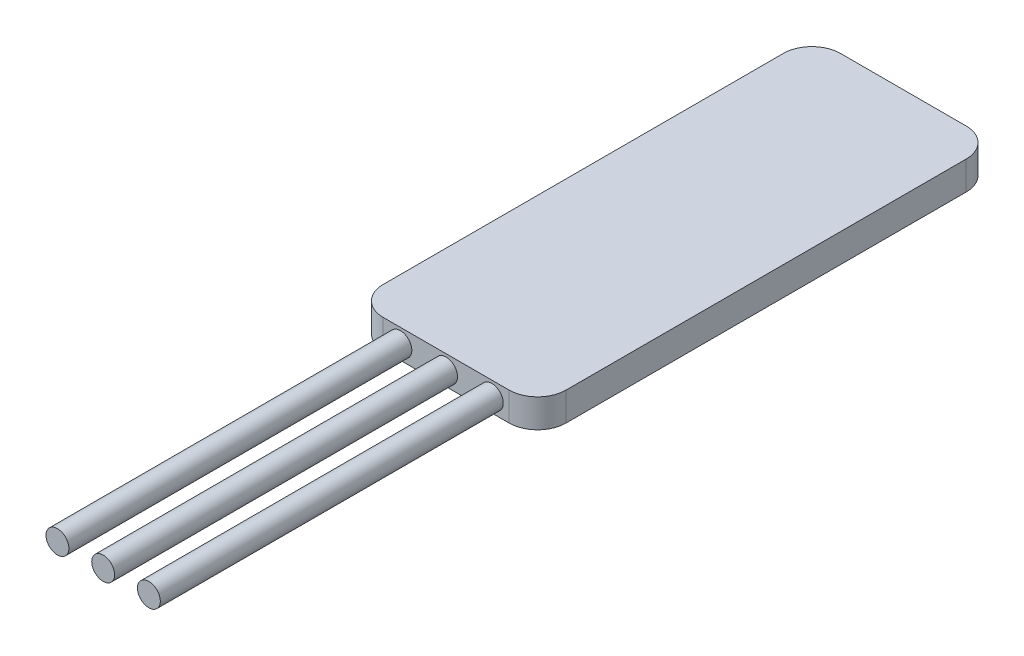
ISO-10303-21;
HEADER;
FILE_DESCRIPTION(('STEP AP214'),'2;1');
FILE_NAME('part.step','',(''),(''),'','','');
FILE_SCHEMA(('AUTOMOTIVE_DESIGN { 1 0 10303 214 1 1 1 1 }'));
ENDSEC;
DATA;
#1=APPLICATION_CONTEXT('core data for automotive mechanical design processes');
#2=APPLICATION_PROTOCOL_DEFINITION('international standard','automotive_design',2000,#1);
#3=PRODUCT_CONTEXT('',#1,'mechanical');
#4=PRODUCT('Part','Part','',(#3));
#5=PRODUCT_RELATED_PRODUCT_CATEGORY('part','',(#4));
#6=PRODUCT_DEFINITION_FORMATION('','',#4);
#7=PRODUCT_DEFINITION_CONTEXT('part definition',#1,'design');
#8=PRODUCT_DEFINITION('design','',#6,#7);
#9=PRODUCT_DEFINITION_SHAPE('','',#8);
#10=(LENGTH_UNIT() NAMED_UNIT(*) SI_UNIT(.MILLI.,.METRE.));
#11=(NAMED_UNIT(*) PLANE_ANGLE_UNIT() SI_UNIT($,.RADIAN.));
#12=(NAMED_UNIT(*) SI_UNIT($,.STERADIAN.) SOLID_ANGLE_UNIT());
#13=UNCERTAINTY_MEASURE_WITH_UNIT(LENGTH_MEASURE(1.E-05),#10,'distance_accuracy_value','');
#14=(GEOMETRIC_REPRESENTATION_CONTEXT(3) GLOBAL_UNCERTAINTY_ASSIGNED_CONTEXT((#13)) GLOBAL_UNIT_ASSIGNED_CONTEXT((#10,
#11,#12)) REPRESENTATION_CONTEXT('',''));
#15=CARTESIAN_POINT('',(0.,0.,0.));
#16=DIRECTION('',(0.,0.,1.));
#17=DIRECTION('',(1.,0.,0.));
#18=AXIS2_PLACEMENT_3D('',#15,#16,#17);
#19=CARTESIAN_POINT('',(3.2,0.5,-8.));
#20=DIRECTION('',(-1.,0.,0.));
#21=DIRECTION('',(0.,0.,1.));
#22=AXIS2_PLACEMENT_3D('',#19,#20,#21);
#23=PLANE('',#22);
#24=DIRECTION('',(0.,0.,-1.));
#25=VECTOR('',#24,1.);
#26=CARTESIAN_POINT('',(3.2,-0.5,-8.));
#27=LINE('',#26,#25);
#28=CARTESIAN_POINT('',(3.2,-0.5,7.));
#29=VERTEX_POINT('',#28);
#30=CARTESIAN_POINT('',(3.2,-0.5,-7.));
#31=VERTEX_POINT('',#30);
#32=EDGE_CURVE('E132',#29,#31,#27,.T.);
#33=ORIENTED_EDGE('',*,*,#32,.T.);
#34=DIRECTION('',(0.,-1.,0.));
#35=VECTOR('',#34,1.);
#36=CARTESIAN_POINT('',(3.2,0.5,-7.));
#37=LINE('',#36,#35);
#38=CARTESIAN_POINT('',(3.2,0.5,-7.));
#39=VERTEX_POINT('',#38);
#40=EDGE_CURVE('E154',#31,#39,#37,.F.);
#41=ORIENTED_EDGE('',*,*,#40,.T.);
#42=DIRECTION('',(0.,0.,-1.));
#43=VECTOR('',#42,1.);
#44=CARTESIAN_POINT('',(3.2,0.5,-8.));
#45=LINE('',#44,#43);
#46=CARTESIAN_POINT('',(3.2,0.5,7.));
#47=VERTEX_POINT('',#46);
#48=EDGE_CURVE('E130',#47,#39,#45,.T.);
#49=ORIENTED_EDGE('',*,*,#48,.F.);
#50=DIRECTION('',(0.,-1.,0.));
#51=VECTOR('',#50,1.);
#52=CARTESIAN_POINT('',(3.2,0.5,7.));
#53=LINE('',#52,#51);
#54=EDGE_CURVE('E151',#47,#29,#53,.T.);
#55=ORIENTED_EDGE('',*,*,#54,.T.);
#56=EDGE_LOOP('',(#33,#41,#49,#55));
#57=FACE_BOUND('',#56,.T.);
#58=ADVANCED_FACE('F34',(#57),#23,.F.);
#59=CARTESIAN_POINT('',(-3.2,0.5,-8.));
#60=DIRECTION('',(0.,0.,1.));
#61=DIRECTION('',(1.,0.,0.));
#62=AXIS2_PLACEMENT_3D('',#59,#60,#61);
#63=PLANE('',#62);
#64=DIRECTION('',(-1.,0.,0.));
#65=VECTOR('',#64,1.);
#66=CARTESIAN_POINT('',(-3.2,-0.5,-8.));
#67=LINE('',#66,#65);
#68=CARTESIAN_POINT('',(2.2,-0.5,-8.));
#69=VERTEX_POINT('',#68);
#70=CARTESIAN_POINT('',(-2.2,-0.5,-8.));
#71=VERTEX_POINT('',#70);
#72=EDGE_CURVE('E128',#69,#71,#67,.T.);
#73=ORIENTED_EDGE('',*,*,#72,.T.);
#74=DIRECTION('',(0.,-1.,0.));
#75=VECTOR('',#74,1.);
#76=CARTESIAN_POINT('',(-2.2,0.5,-8.));
#77=LINE('',#76,#75);
#78=CARTESIAN_POINT('',(-2.2,0.5,-8.));
#79=VERTEX_POINT('',#78);
#80=EDGE_CURVE('E106',#71,#79,#77,.F.);
#81=ORIENTED_EDGE('',*,*,#80,.T.);
#82=DIRECTION('',(-1.,0.,0.));
#83=VECTOR('',#82,1.);
#84=CARTESIAN_POINT('',(-3.2,0.5,-8.));
#85=LINE('',#84,#83);
#86=CARTESIAN_POINT('',(2.2,0.5,-8.));
#87=VERTEX_POINT('',#86);
#88=EDGE_CURVE('E180',#87,#79,#85,.T.);
#89=ORIENTED_EDGE('',*,*,#88,.F.);
#90=DIRECTION('',(0.,-1.,0.));
#91=VECTOR('',#90,1.);
#92=CARTESIAN_POINT('',(2.2,0.5,-8.));
#93=LINE('',#92,#91);
#94=EDGE_CURVE('E111',#87,#69,#93,.T.);
#95=ORIENTED_EDGE('',*,*,#94,.T.);
#96=EDGE_LOOP('',(#73,#81,#89,#95));
#97=FACE_BOUND('',#96,.T.);
#98=ADVANCED_FACE('F207',(#97),#63,.F.);
#99=CARTESIAN_POINT('',(-3.2,0.5,-8.));
#100=DIRECTION('',(1.,0.,0.));
#101=DIRECTION('',(0.,0.,-1.));
#102=AXIS2_PLACEMENT_3D('',#99,#100,#101);
#103=PLANE('',#102);
#104=DIRECTION('',(0.,0.,1.));
#105=VECTOR('',#104,1.);
#106=CARTESIAN_POINT('',(-3.2,0.5,-8.));
#107=LINE('',#106,#105);
#108=CARTESIAN_POINT('',(-3.2,0.5,-7.));
#109=VERTEX_POINT('',#108);
#110=CARTESIAN_POINT('',(-3.2,0.5,7.));
#111=VERTEX_POINT('',#110);
#112=EDGE_CURVE('E120',#109,#111,#107,.T.);
#113=ORIENTED_EDGE('',*,*,#112,.F.);
#114=DIRECTION('',(0.,-1.,0.));
#115=VECTOR('',#114,1.);
#116=CARTESIAN_POINT('',(-3.2,0.5,-7.));
#117=LINE('',#116,#115);
#118=CARTESIAN_POINT('',(-3.2,-0.5,-7.));
#119=VERTEX_POINT('',#118);
#120=EDGE_CURVE('E105',#109,#119,#117,.T.);
#121=ORIENTED_EDGE('',*,*,#120,.T.);
#122=DIRECTION('',(0.,0.,1.));
#123=VECTOR('',#122,1.);
#124=CARTESIAN_POINT('',(-3.2,-0.5,-8.));
#125=LINE('',#124,#123);
#126=CARTESIAN_POINT('',(-3.2,-0.5,7.));
#127=VERTEX_POINT('',#126);
#128=EDGE_CURVE('E118',#119,#127,#125,.T.);
#129=ORIENTED_EDGE('',*,*,#128,.T.);
#130=DIRECTION('',(0.,-1.,0.));
#131=VECTOR('',#130,1.);
#132=CARTESIAN_POINT('',(-3.2,0.5,7.));
#133=LINE('',#132,#131);
#134=EDGE_CURVE('E122',#127,#111,#133,.F.);
#135=ORIENTED_EDGE('',*,*,#134,.T.);
#136=EDGE_LOOP('',(#113,#121,#129,#135));
#137=FACE_BOUND('',#136,.T.);
#138=ADVANCED_FACE('F117',(#137),#103,.F.);
#139=CARTESIAN_POINT('',(-3.2,0.5,8.));
#140=DIRECTION('',(0.,0.,-1.));
#141=DIRECTION('',(-1.,0.,0.));
#142=AXIS2_PLACEMENT_3D('',#139,#140,#141);
#143=PLANE('',#142);
#144=CARTESIAN_POINT('',(1.6,0.,8.));
#145=DIRECTION('',(0.,0.,-1.));
#146=DIRECTION('',(-1.,0.,0.));
#147=AXIS2_PLACEMENT_3D('',#144,#145,#146);
#148=CIRCLE('',#147,0.4);
#149=CARTESIAN_POINT('',(1.2,0.,8.));
#150=VERTEX_POINT('',#149);
#151=EDGE_CURVE('E11',#150,#150,#148,.F.);
#152=ORIENTED_EDGE('',*,*,#151,.F.);
#153=EDGE_LOOP('',(#152));
#154=FACE_BOUND('',#153,.T.);
#155=CARTESIAN_POINT('',(-1.6,0.,8.));
#156=DIRECTION('',(0.,0.,-1.));
#157=DIRECTION('',(-1.,0.,0.));
#158=AXIS2_PLACEMENT_3D('',#155,#156,#157);
#159=CIRCLE('',#158,0.4);
#160=CARTESIAN_POINT('',(-2.,0.,8.));
#161=VERTEX_POINT('',#160);
#162=EDGE_CURVE('E42',#161,#161,#159,.F.);
#163=ORIENTED_EDGE('',*,*,#162,.F.);
#164=EDGE_LOOP('',(#163));
#165=FACE_BOUND('',#164,.T.);
#166=CARTESIAN_POINT('',(0.,0.,8.));
#167=DIRECTION('',(0.,0.,-1.));
#168=DIRECTION('',(-1.,0.,0.));
#169=AXIS2_PLACEMENT_3D('',#166,#167,#168);
#170=CIRCLE('',#169,0.4);
#171=CARTESIAN_POINT('',(-0.4,0.,8.));
#172=VERTEX_POINT('',#171);
#173=EDGE_CURVE('E160',#172,#172,#170,.F.);
#174=ORIENTED_EDGE('',*,*,#173,.F.);
#175=EDGE_LOOP('',(#174));
#176=FACE_BOUND('',#175,.T.);
#177=DIRECTION('',(1.,0.,0.));
#178=VECTOR('',#177,1.);
#179=CARTESIAN_POINT('',(-3.2,0.5,8.));
#180=LINE('',#179,#178);
#181=CARTESIAN_POINT('',(-2.2,0.5,8.));
#182=VERTEX_POINT('',#181);
#183=CARTESIAN_POINT('',(2.2,0.5,8.));
#184=VERTEX_POINT('',#183);
#185=EDGE_CURVE('E136',#182,#184,#180,.T.);
#186=ORIENTED_EDGE('',*,*,#185,.F.);
#187=DIRECTION('',(0.,-1.,0.));
#188=VECTOR('',#187,1.);
#189=CARTESIAN_POINT('',(-2.2,0.5,8.));
#190=LINE('',#189,#188);
#191=CARTESIAN_POINT('',(-2.2,-0.5,8.));
#192=VERTEX_POINT('',#191);
#193=EDGE_CURVE('E157',#182,#192,#190,.T.);
#194=ORIENTED_EDGE('',*,*,#193,.T.);
#195=DIRECTION('',(1.,0.,0.));
#196=VECTOR('',#195,1.);
#197=CARTESIAN_POINT('',(-3.2,-0.5,8.));
#198=LINE('',#197,#196);
#199=CARTESIAN_POINT('',(2.2,-0.5,8.));
#200=VERTEX_POINT('',#199);
#201=EDGE_CURVE('E127',#192,#200,#198,.T.);
#202=ORIENTED_EDGE('',*,*,#201,.T.);
#203=DIRECTION('',(0.,-1.,0.));
#204=VECTOR('',#203,1.);
#205=CARTESIAN_POINT('',(2.2,0.5,8.));
#206=LINE('',#205,#204);
#207=EDGE_CURVE('E49',#200,#184,#206,.F.);
#208=ORIENTED_EDGE('',*,*,#207,.T.);
#209=EDGE_LOOP('',(#186,#194,#202,#208));
#210=FACE_BOUND('',#209,.T.);
#211=ADVANCED_FACE('F167',(#154,#165,#176,#210),#143,.F.);
#212=CARTESIAN_POINT('',(0.,0.5,0.));
#213=DIRECTION('',(0.,1.,0.));
#214=DIRECTION('',(0.,0.,1.));
#215=AXIS2_PLACEMENT_3D('',#212,#213,#214);
#216=PLANE('',#215);
#217=ORIENTED_EDGE('',*,*,#88,.T.);
#218=CARTESIAN_POINT('',(-2.2,0.5,-7.));
#219=DIRECTION('',(0.,1.,0.));
#220=DIRECTION('',(0.,0.,1.));
#221=AXIS2_PLACEMENT_3D('',#218,#219,#220);
#222=CIRCLE('',#221,1.);
#223=EDGE_CURVE('E149',#79,#109,#222,.T.);
#224=ORIENTED_EDGE('',*,*,#223,.T.);
#225=ORIENTED_EDGE('',*,*,#112,.T.);
#226=CARTESIAN_POINT('',(-2.2,0.5,7.));
#227=DIRECTION('',(0.,1.,0.));
#228=DIRECTION('',(0.,0.,1.));
#229=AXIS2_PLACEMENT_3D('',#226,#227,#228);
#230=CIRCLE('',#229,1.);
#231=EDGE_CURVE('E56',#111,#182,#230,.T.);
#232=ORIENTED_EDGE('',*,*,#231,.T.);
#233=ORIENTED_EDGE('',*,*,#185,.T.);
#234=CARTESIAN_POINT('',(2.2,0.5,7.));
#235=DIRECTION('',(0.,1.,0.));
#236=DIRECTION('',(0.,0.,1.));
#237=AXIS2_PLACEMENT_3D('',#234,#235,#236);
#238=CIRCLE('',#237,1.);
#239=EDGE_CURVE('E144',#184,#47,#238,.T.);
#240=ORIENTED_EDGE('',*,*,#239,.T.);
#241=ORIENTED_EDGE('',*,*,#48,.T.);
#242=CARTESIAN_POINT('',(2.2,0.5,-7.));
#243=DIRECTION('',(0.,1.,0.));
#244=DIRECTION('',(0.,0.,1.));
#245=AXIS2_PLACEMENT_3D('',#242,#243,#244);
#246=CIRCLE('',#245,1.);
#247=EDGE_CURVE('E147',#39,#87,#246,.T.);
#248=ORIENTED_EDGE('',*,*,#247,.T.);
#249=EDGE_LOOP('',(#217,#224,#225,#232,#233,#240,#241,#248));
#250=FACE_BOUND('',#249,.T.);
#251=ADVANCED_FACE('F170',(#250),#216,.T.);
#252=CARTESIAN_POINT('',(0.,-0.5,0.));
#253=DIRECTION('',(0.,1.,0.));
#254=DIRECTION('',(0.,0.,1.));
#255=AXIS2_PLACEMENT_3D('',#252,#253,#254);
#256=PLANE('',#255);
#257=ORIENTED_EDGE('',*,*,#128,.F.);
#258=CARTESIAN_POINT('',(-2.2,-0.5,-7.));
#259=DIRECTION('',(0.,1.,0.));
#260=DIRECTION('',(0.,0.,1.));
#261=AXIS2_PLACEMENT_3D('',#258,#259,#260);
#262=CIRCLE('',#261,1.);
#263=EDGE_CURVE('E101',#119,#71,#262,.F.);
#264=ORIENTED_EDGE('',*,*,#263,.T.);
#265=ORIENTED_EDGE('',*,*,#72,.F.);
#266=CARTESIAN_POINT('',(2.2,-0.5,-7.));
#267=DIRECTION('',(0.,1.,0.));
#268=DIRECTION('',(0.,0.,1.));
#269=AXIS2_PLACEMENT_3D('',#266,#267,#268);
#270=CIRCLE('',#269,1.);
#271=EDGE_CURVE('E112',#69,#31,#270,.F.);
#272=ORIENTED_EDGE('',*,*,#271,.T.);
#273=ORIENTED_EDGE('',*,*,#32,.F.);
#274=CARTESIAN_POINT('',(2.2,-0.5,7.));
#275=DIRECTION('',(0.,1.,0.));
#276=DIRECTION('',(0.,0.,1.));
#277=AXIS2_PLACEMENT_3D('',#274,#275,#276);
#278=CIRCLE('',#277,1.);
#279=EDGE_CURVE('E121',#29,#200,#278,.F.);
#280=ORIENTED_EDGE('',*,*,#279,.T.);
#281=ORIENTED_EDGE('',*,*,#201,.F.);
#282=CARTESIAN_POINT('',(-2.2,-0.5,7.));
#283=DIRECTION('',(0.,1.,0.));
#284=DIRECTION('',(0.,0.,1.));
#285=AXIS2_PLACEMENT_3D('',#282,#283,#284);
#286=CIRCLE('',#285,1.);
#287=EDGE_CURVE('E126',#192,#127,#286,.F.);
#288=ORIENTED_EDGE('',*,*,#287,.T.);
#289=EDGE_LOOP('',(#257,#264,#265,#272,#273,#280,#281,#288));
#290=FACE_BOUND('',#289,.T.);
#291=ADVANCED_FACE('F124',(#290),#256,.F.);
#292=CARTESIAN_POINT('',(-2.2,0.5,-7.));
#293=DIRECTION('',(0.,-1.,0.));
#294=DIRECTION('',(0.,0.,-1.));
#295=AXIS2_PLACEMENT_3D('',#292,#293,#294);
#296=CYLINDRICAL_SURFACE('',#295,1.);
#297=ORIENTED_EDGE('',*,*,#223,.F.);
#298=ORIENTED_EDGE('',*,*,#80,.F.);
#299=ORIENTED_EDGE('',*,*,#263,.F.);
#300=ORIENTED_EDGE('',*,*,#120,.F.);
#301=EDGE_LOOP('',(#297,#298,#299,#300));
#302=FACE_BOUND('',#301,.T.);
#303=ADVANCED_FACE('F104',(#302),#296,.T.);
#304=CARTESIAN_POINT('',(2.2,0.5,-7.));
#305=DIRECTION('',(0.,-1.,0.));
#306=DIRECTION('',(0.,0.,-1.));
#307=AXIS2_PLACEMENT_3D('',#304,#305,#306);
#308=CYLINDRICAL_SURFACE('',#307,1.);
#309=ORIENTED_EDGE('',*,*,#247,.F.);
#310=ORIENTED_EDGE('',*,*,#40,.F.);
#311=ORIENTED_EDGE('',*,*,#271,.F.);
#312=ORIENTED_EDGE('',*,*,#94,.F.);
#313=EDGE_LOOP('',(#309,#310,#311,#312));
#314=FACE_BOUND('',#313,.T.);
#315=ADVANCED_FACE('F205',(#314),#308,.T.);
#316=CARTESIAN_POINT('',(-2.2,0.5,7.));
#317=DIRECTION('',(0.,-1.,0.));
#318=DIRECTION('',(0.,0.,-1.));
#319=AXIS2_PLACEMENT_3D('',#316,#317,#318);
#320=CYLINDRICAL_SURFACE('',#319,1.);
#321=ORIENTED_EDGE('',*,*,#231,.F.);
#322=ORIENTED_EDGE('',*,*,#134,.F.);
#323=ORIENTED_EDGE('',*,*,#287,.F.);
#324=ORIENTED_EDGE('',*,*,#193,.F.);
#325=EDGE_LOOP('',(#321,#322,#323,#324));
#326=FACE_BOUND('',#325,.T.);
#327=ADVANCED_FACE('F178',(#326),#320,.T.);
#328=CARTESIAN_POINT('',(2.2,0.5,7.));
#329=DIRECTION('',(0.,-1.,0.));
#330=DIRECTION('',(0.,0.,-1.));
#331=AXIS2_PLACEMENT_3D('',#328,#329,#330);
#332=CYLINDRICAL_SURFACE('',#331,1.);
#333=ORIENTED_EDGE('',*,*,#239,.F.);
#334=ORIENTED_EDGE('',*,*,#207,.F.);
#335=ORIENTED_EDGE('',*,*,#279,.F.);
#336=ORIENTED_EDGE('',*,*,#54,.F.);
#337=EDGE_LOOP('',(#333,#334,#335,#336));
#338=FACE_BOUND('',#337,.T.);
#339=ADVANCED_FACE('F36',(#338),#332,.T.);
#340=CARTESIAN_POINT('',(0.,0.,20.));
#341=DIRECTION('',(0.,0.,-1.));
#342=DIRECTION('',(-1.,0.,0.));
#343=AXIS2_PLACEMENT_3D('',#340,#341,#342);
#344=CYLINDRICAL_SURFACE('',#343,0.4);
#345=CARTESIAN_POINT('',(0.,0.,20.));
#346=DIRECTION('',(0.,0.,1.));
#347=DIRECTION('',(1.,0.,0.));
#348=AXIS2_PLACEMENT_3D('',#345,#346,#347);
#349=CIRCLE('',#348,0.4);
#350=CARTESIAN_POINT('',(0.4,0.,20.));
#351=VERTEX_POINT('',#350);
#352=EDGE_CURVE('E185',#351,#351,#349,.T.);
#353=ORIENTED_EDGE('',*,*,#352,.F.);
#354=EDGE_LOOP('',(#353));
#355=FACE_BOUND('',#354,.T.);
#356=ORIENTED_EDGE('',*,*,#173,.T.);
#357=EDGE_LOOP('',(#356));
#358=FACE_BOUND('',#357,.T.);
#359=ADVANCED_FACE('F224',(#355,#358),#344,.T.);
#360=CARTESIAN_POINT('',(0.,0.,20.));
#361=DIRECTION('',(0.,0.,1.));
#362=DIRECTION('',(1.,0.,0.));
#363=AXIS2_PLACEMENT_3D('',#360,#361,#362);
#364=PLANE('',#363);
#365=ORIENTED_EDGE('',*,*,#352,.T.);
#366=EDGE_LOOP('',(#365));
#367=FACE_BOUND('',#366,.T.);
#368=ADVANCED_FACE('F228',(#367),#364,.T.);
#369=CARTESIAN_POINT('',(-1.6,0.,20.));
#370=DIRECTION('',(0.,0.,-1.));
#371=DIRECTION('',(-1.,0.,0.));
#372=AXIS2_PLACEMENT_3D('',#369,#370,#371);
#373=CYLINDRICAL_SURFACE('',#372,0.4);
#374=CARTESIAN_POINT('',(-1.6,0.,20.));
#375=DIRECTION('',(0.,0.,1.));
#376=DIRECTION('',(1.,0.,0.));
#377=AXIS2_PLACEMENT_3D('',#374,#375,#376);
#378=CIRCLE('',#377,0.4);
#379=CARTESIAN_POINT('',(-1.2,0.,20.));
#380=VERTEX_POINT('',#379);
#381=EDGE_CURVE('E190',#380,#380,#378,.T.);
#382=ORIENTED_EDGE('',*,*,#381,.F.);
#383=EDGE_LOOP('',(#382));
#384=FACE_BOUND('',#383,.T.);
#385=ORIENTED_EDGE('',*,*,#162,.T.);
#386=EDGE_LOOP('',(#385));
#387=FACE_BOUND('',#386,.T.);
#388=ADVANCED_FACE('F165',(#384,#387),#373,.T.);
#389=CARTESIAN_POINT('',(-1.6,0.,20.));
#390=DIRECTION('',(0.,0.,1.));
#391=DIRECTION('',(1.,0.,0.));
#392=AXIS2_PLACEMENT_3D('',#389,#390,#391);
#393=PLANE('',#392);
#394=ORIENTED_EDGE('',*,*,#381,.T.);
#395=EDGE_LOOP('',(#394));
#396=FACE_BOUND('',#395,.T.);
#397=ADVANCED_FACE('F296',(#396),#393,.T.);
#398=CARTESIAN_POINT('',(1.6,0.,20.));
#399=DIRECTION('',(0.,0.,-1.));
#400=DIRECTION('',(-1.,0.,0.));
#401=AXIS2_PLACEMENT_3D('',#398,#399,#400);
#402=CYLINDRICAL_SURFACE('',#401,0.4);
#403=CARTESIAN_POINT('',(1.6,0.,20.));
#404=DIRECTION('',(0.,0.,1.));
#405=DIRECTION('',(1.,0.,0.));
#406=AXIS2_PLACEMENT_3D('',#403,#404,#405);
#407=CIRCLE('',#406,0.4);
#408=CARTESIAN_POINT('',(2.,0.,20.));
#409=VERTEX_POINT('',#408);
#410=EDGE_CURVE('E195',#409,#409,#407,.T.);
#411=ORIENTED_EDGE('',*,*,#410,.F.);
#412=EDGE_LOOP('',(#411));
#413=FACE_BOUND('',#412,.T.);
#414=ORIENTED_EDGE('',*,*,#151,.T.);
#415=EDGE_LOOP('',(#414));
#416=FACE_BOUND('',#415,.T.);
#417=ADVANCED_FACE('F303',(#413,#416),#402,.T.);
#418=CARTESIAN_POINT('',(1.6,0.,20.));
#419=DIRECTION('',(0.,0.,1.));
#420=DIRECTION('',(1.,0.,0.));
#421=AXIS2_PLACEMENT_3D('',#418,#419,#420);
#422=PLANE('',#421);
#423=ORIENTED_EDGE('',*,*,#410,.T.);
#424=EDGE_LOOP('',(#423));
#425=FACE_BOUND('',#424,.T.);
#426=ADVANCED_FACE('F311',(#425),#422,.T.);
#427=CLOSED_SHELL('',(#58,#98,#138,#211,#251,#291,#303,#315,#327,#339,#359,#368,#388,#397,#417,#426));
#428=MANIFOLD_SOLID_BREP('B2',#427);
#429=ADVANCED_BREP_SHAPE_REPRESENTATION('',(#18,#428),#14);
#430=SHAPE_DEFINITION_REPRESENTATION(#9,#429);
ENDSEC;
END-ISO-10303-21;
